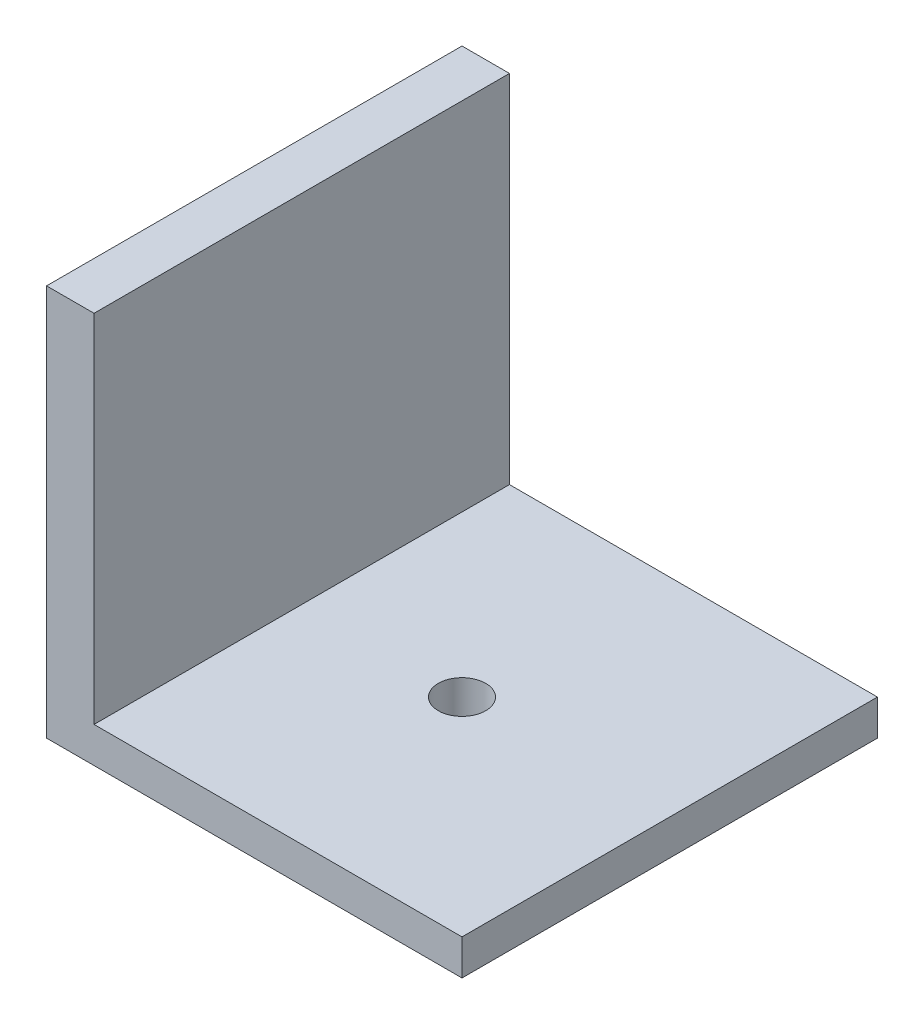
ISO-10303-21;
HEADER;
FILE_DESCRIPTION(('STEP AP214'),'2;1');
FILE_NAME('part.step','',(''),(''),'','','');
FILE_SCHEMA(('AUTOMOTIVE_DESIGN { 1 0 10303 214 1 1 1 1 }'));
ENDSEC;
DATA;
#1=APPLICATION_CONTEXT('core data for automotive mechanical design processes');
#2=APPLICATION_PROTOCOL_DEFINITION('international standard','automotive_design',2000,#1);
#3=PRODUCT_CONTEXT('',#1,'mechanical');
#4=PRODUCT('Part','Part','',(#3));
#5=PRODUCT_RELATED_PRODUCT_CATEGORY('part','',(#4));
#6=PRODUCT_DEFINITION_FORMATION('','',#4);
#7=PRODUCT_DEFINITION_CONTEXT('part definition',#1,'design');
#8=PRODUCT_DEFINITION('design','',#6,#7);
#9=PRODUCT_DEFINITION_SHAPE('','',#8);
#10=(LENGTH_UNIT() NAMED_UNIT(*) SI_UNIT(.MILLI.,.METRE.));
#11=(NAMED_UNIT(*) PLANE_ANGLE_UNIT() SI_UNIT($,.RADIAN.));
#12=(NAMED_UNIT(*) SI_UNIT($,.STERADIAN.) SOLID_ANGLE_UNIT());
#13=UNCERTAINTY_MEASURE_WITH_UNIT(LENGTH_MEASURE(1.E-05),#10,'distance_accuracy_value','');
#14=(GEOMETRIC_REPRESENTATION_CONTEXT(3) GLOBAL_UNCERTAINTY_ASSIGNED_CONTEXT((#13)) GLOBAL_UNIT_ASSIGNED_CONTEXT((#10,
#11,#12)) REPRESENTATION_CONTEXT('',''));
#15=CARTESIAN_POINT('',(0.,0.,0.));
#16=DIRECTION('',(0.,0.,1.));
#17=DIRECTION('',(1.,0.,0.));
#18=AXIS2_PLACEMENT_3D('',#15,#16,#17);
#19=CARTESIAN_POINT('',(0.,3.,0.));
#20=DIRECTION('',(0.,-1.,0.));
#21=DIRECTION('',(0.,0.,-1.));
#22=AXIS2_PLACEMENT_3D('',#19,#20,#21);
#23=PLANE('',#22);
#24=CARTESIAN_POINT('',(0.,3.,0.));
#25=DIRECTION('',(0.,1.,0.));
#26=DIRECTION('',(0.,0.,1.));
#27=AXIS2_PLACEMENT_3D('',#24,#25,#26);
#28=CIRCLE('',#27,2.);
#29=CARTESIAN_POINT('',(0.,3.,2.));
#30=VERTEX_POINT('',#29);
#31=EDGE_CURVE('E104',#30,#30,#28,.T.);
#32=ORIENTED_EDGE('',*,*,#31,.F.);
#33=EDGE_LOOP('',(#32));
#34=FACE_BOUND('',#33,.T.);
#35=DIRECTION('',(0.,0.,-1.));
#36=VECTOR('',#35,1.);
#37=CARTESIAN_POINT('',(-13.5,3.,-17.5));
#38=LINE('',#37,#36);
#39=CARTESIAN_POINT('',(-13.5,3.,17.5));
#40=VERTEX_POINT('',#39);
#41=CARTESIAN_POINT('',(-13.5,3.,-17.5));
#42=VERTEX_POINT('',#41);
#43=EDGE_CURVE('E56',#40,#42,#38,.T.);
#44=ORIENTED_EDGE('',*,*,#43,.F.);
#45=DIRECTION('',(1.,0.,0.));
#46=VECTOR('',#45,1.);
#47=CARTESIAN_POINT('',(-17.5,3.,17.5));
#48=LINE('',#47,#46);
#49=CARTESIAN_POINT('',(17.5,3.,17.5));
#50=VERTEX_POINT('',#49);
#51=EDGE_CURVE('E61',#40,#50,#48,.T.);
#52=ORIENTED_EDGE('',*,*,#51,.T.);
#53=DIRECTION('',(0.,0.,-1.));
#54=VECTOR('',#53,1.);
#55=CARTESIAN_POINT('',(17.5,3.,17.5));
#56=LINE('',#55,#54);
#57=CARTESIAN_POINT('',(17.5,3.,-17.5));
#58=VERTEX_POINT('',#57);
#59=EDGE_CURVE('E92',#50,#58,#56,.T.);
#60=ORIENTED_EDGE('',*,*,#59,.T.);
#61=DIRECTION('',(-1.,0.,0.));
#62=VECTOR('',#61,1.);
#63=CARTESIAN_POINT('',(-17.5,3.,-17.5));
#64=LINE('',#63,#62);
#65=EDGE_CURVE('E122',#58,#42,#64,.T.);
#66=ORIENTED_EDGE('',*,*,#65,.T.);
#67=EDGE_LOOP('',(#44,#52,#60,#66));
#68=FACE_BOUND('',#67,.T.);
#69=ADVANCED_FACE('F40',(#34,#68),#23,.F.);
#70=CARTESIAN_POINT('',(0.,0.,0.));
#71=DIRECTION('',(0.,-1.,0.));
#72=DIRECTION('',(0.,0.,-1.));
#73=AXIS2_PLACEMENT_3D('',#70,#71,#72);
#74=PLANE('',#73);
#75=DIRECTION('',(0.,0.,-1.));
#76=VECTOR('',#75,1.);
#77=CARTESIAN_POINT('',(17.5,0.,17.5));
#78=LINE('',#77,#76);
#79=CARTESIAN_POINT('',(17.5,0.,17.5));
#80=VERTEX_POINT('',#79);
#81=CARTESIAN_POINT('',(17.5,0.,-17.5));
#82=VERTEX_POINT('',#81);
#83=EDGE_CURVE('E98',#80,#82,#78,.T.);
#84=ORIENTED_EDGE('',*,*,#83,.F.);
#85=DIRECTION('',(1.,0.,0.));
#86=VECTOR('',#85,1.);
#87=CARTESIAN_POINT('',(-17.5,0.,17.5));
#88=LINE('',#87,#86);
#89=CARTESIAN_POINT('',(-17.5,0.,17.5));
#90=VERTEX_POINT('',#89);
#91=EDGE_CURVE('E81',#90,#80,#88,.T.);
#92=ORIENTED_EDGE('',*,*,#91,.F.);
#93=DIRECTION('',(0.,0.,1.));
#94=VECTOR('',#93,1.);
#95=CARTESIAN_POINT('',(-17.5,0.,17.5));
#96=LINE('',#95,#94);
#97=CARTESIAN_POINT('',(-17.5,0.,-17.5));
#98=VERTEX_POINT('',#97);
#99=EDGE_CURVE('E93',#98,#90,#96,.T.);
#100=ORIENTED_EDGE('',*,*,#99,.F.);
#101=DIRECTION('',(-1.,0.,0.));
#102=VECTOR('',#101,1.);
#103=CARTESIAN_POINT('',(-17.5,0.,-17.5));
#104=LINE('',#103,#102);
#105=EDGE_CURVE('E102',#82,#98,#104,.T.);
#106=ORIENTED_EDGE('',*,*,#105,.F.);
#107=EDGE_LOOP('',(#84,#92,#100,#106));
#108=FACE_BOUND('',#107,.T.);
#109=CARTESIAN_POINT('',(0.,0.,0.));
#110=DIRECTION('',(0.,1.,0.));
#111=DIRECTION('',(0.,0.,1.));
#112=AXIS2_PLACEMENT_3D('',#109,#110,#111);
#113=CIRCLE('',#112,2.);
#114=CARTESIAN_POINT('',(0.,0.,2.));
#115=VERTEX_POINT('',#114);
#116=EDGE_CURVE('E108',#115,#115,#113,.T.);
#117=ORIENTED_EDGE('',*,*,#116,.T.);
#118=EDGE_LOOP('',(#117));
#119=FACE_BOUND('',#118,.T.);
#120=ADVANCED_FACE('F100',(#108,#119),#74,.T.);
#121=CARTESIAN_POINT('',(17.5,3.,17.5));
#122=DIRECTION('',(-1.,0.,0.));
#123=DIRECTION('',(0.,0.,1.));
#124=AXIS2_PLACEMENT_3D('',#121,#122,#123);
#125=PLANE('',#124);
#126=ORIENTED_EDGE('',*,*,#83,.T.);
#127=DIRECTION('',(0.,-1.,0.));
#128=VECTOR('',#127,1.);
#129=CARTESIAN_POINT('',(17.5,3.,-17.5));
#130=LINE('',#129,#128);
#131=EDGE_CURVE('E44',#58,#82,#130,.T.);
#132=ORIENTED_EDGE('',*,*,#131,.F.);
#133=ORIENTED_EDGE('',*,*,#59,.F.);
#134=DIRECTION('',(0.,-1.,0.));
#135=VECTOR('',#134,1.);
#136=CARTESIAN_POINT('',(17.5,3.,17.5));
#137=LINE('',#136,#135);
#138=EDGE_CURVE('E84',#50,#80,#137,.T.);
#139=ORIENTED_EDGE('',*,*,#138,.T.);
#140=EDGE_LOOP('',(#126,#132,#133,#139));
#141=FACE_BOUND('',#140,.T.);
#142=ADVANCED_FACE('F42',(#141),#125,.F.);
#143=CARTESIAN_POINT('',(-17.5,3.,-17.5));
#144=DIRECTION('',(0.,0.,1.));
#145=DIRECTION('',(1.,0.,0.));
#146=AXIS2_PLACEMENT_3D('',#143,#144,#145);
#147=PLANE('',#146);
#148=ORIENTED_EDGE('',*,*,#105,.T.);
#149=DIRECTION('',(0.,-1.,0.));
#150=VECTOR('',#149,1.);
#151=CARTESIAN_POINT('',(-17.5,3.,-17.5));
#152=LINE('',#151,#150);
#153=CARTESIAN_POINT('',(-17.5,33.,-17.5));
#154=VERTEX_POINT('',#153);
#155=EDGE_CURVE('E114',#154,#98,#152,.T.);
#156=ORIENTED_EDGE('',*,*,#155,.F.);
#157=DIRECTION('',(-1.,0.,0.));
#158=VECTOR('',#157,1.);
#159=CARTESIAN_POINT('',(-17.5,33.,-17.5));
#160=LINE('',#159,#158);
#161=CARTESIAN_POINT('',(-13.5,33.,-17.5));
#162=VERTEX_POINT('',#161);
#163=EDGE_CURVE('E135',#162,#154,#160,.T.);
#164=ORIENTED_EDGE('',*,*,#163,.F.);
#165=DIRECTION('',(0.,-1.,0.));
#166=VECTOR('',#165,1.);
#167=CARTESIAN_POINT('',(-13.5,33.,-17.5));
#168=LINE('',#167,#166);
#169=EDGE_CURVE('E126',#162,#42,#168,.T.);
#170=ORIENTED_EDGE('',*,*,#169,.T.);
#171=ORIENTED_EDGE('',*,*,#65,.F.);
#172=ORIENTED_EDGE('',*,*,#131,.T.);
#173=EDGE_LOOP('',(#148,#156,#164,#170,#171,#172));
#174=FACE_BOUND('',#173,.T.);
#175=ADVANCED_FACE('F120',(#174),#147,.F.);
#176=CARTESIAN_POINT('',(-17.5,3.,17.5));
#177=DIRECTION('',(1.,0.,0.));
#178=DIRECTION('',(0.,0.,-1.));
#179=AXIS2_PLACEMENT_3D('',#176,#177,#178);
#180=PLANE('',#179);
#181=CARTESIAN_POINT('',(-17.5,16.5,0.));
#182=DIRECTION('',(-1.,0.,0.));
#183=DIRECTION('',(0.,0.,1.));
#184=AXIS2_PLACEMENT_3D('',#181,#182,#183);
#185=CIRCLE('',#184,4.);
#186=CARTESIAN_POINT('',(-17.5,16.5,4.));
#187=VERTEX_POINT('',#186);
#188=EDGE_CURVE('E11',#187,#187,#185,.T.);
#189=ORIENTED_EDGE('',*,*,#188,.F.);
#190=EDGE_LOOP('',(#189));
#191=FACE_BOUND('',#190,.T.);
#192=ORIENTED_EDGE('',*,*,#99,.T.);
#193=DIRECTION('',(0.,-1.,0.));
#194=VECTOR('',#193,1.);
#195=CARTESIAN_POINT('',(-17.5,3.,17.5));
#196=LINE('',#195,#194);
#197=CARTESIAN_POINT('',(-17.5,33.,17.5));
#198=VERTEX_POINT('',#197);
#199=EDGE_CURVE('E88',#198,#90,#196,.T.);
#200=ORIENTED_EDGE('',*,*,#199,.F.);
#201=DIRECTION('',(0.,0.,1.));
#202=VECTOR('',#201,1.);
#203=CARTESIAN_POINT('',(-17.5,33.,-17.5));
#204=LINE('',#203,#202);
#205=EDGE_CURVE('E137',#154,#198,#204,.T.);
#206=ORIENTED_EDGE('',*,*,#205,.F.);
#207=ORIENTED_EDGE('',*,*,#155,.T.);
#208=EDGE_LOOP('',(#192,#200,#206,#207));
#209=FACE_BOUND('',#208,.T.);
#210=ADVANCED_FACE('F161',(#191,#209),#180,.F.);
#211=CARTESIAN_POINT('',(-17.5,3.,17.5));
#212=DIRECTION('',(0.,0.,-1.));
#213=DIRECTION('',(-1.,0.,0.));
#214=AXIS2_PLACEMENT_3D('',#211,#212,#213);
#215=PLANE('',#214);
#216=ORIENTED_EDGE('',*,*,#91,.T.);
#217=ORIENTED_EDGE('',*,*,#138,.F.);
#218=ORIENTED_EDGE('',*,*,#51,.F.);
#219=DIRECTION('',(0.,-1.,0.));
#220=VECTOR('',#219,1.);
#221=CARTESIAN_POINT('',(-13.5,33.,17.5));
#222=LINE('',#221,#220);
#223=CARTESIAN_POINT('',(-13.5,33.,17.5));
#224=VERTEX_POINT('',#223);
#225=EDGE_CURVE('E130',#224,#40,#222,.T.);
#226=ORIENTED_EDGE('',*,*,#225,.F.);
#227=DIRECTION('',(1.,0.,0.));
#228=VECTOR('',#227,1.);
#229=CARTESIAN_POINT('',(-17.5,33.,17.5));
#230=LINE('',#229,#228);
#231=EDGE_CURVE('E144',#198,#224,#230,.T.);
#232=ORIENTED_EDGE('',*,*,#231,.F.);
#233=ORIENTED_EDGE('',*,*,#199,.T.);
#234=EDGE_LOOP('',(#216,#217,#218,#226,#232,#233));
#235=FACE_BOUND('',#234,.T.);
#236=ADVANCED_FACE('F83',(#235),#215,.F.);
#237=CARTESIAN_POINT('',(0.,3.,0.));
#238=DIRECTION('',(0.,-1.,0.));
#239=DIRECTION('',(0.,0.,-1.));
#240=AXIS2_PLACEMENT_3D('',#237,#238,#239);
#241=CYLINDRICAL_SURFACE('',#240,2.);
#242=ORIENTED_EDGE('',*,*,#31,.T.);
#243=EDGE_LOOP('',(#242));
#244=FACE_BOUND('',#243,.T.);
#245=ORIENTED_EDGE('',*,*,#116,.F.);
#246=EDGE_LOOP('',(#245));
#247=FACE_BOUND('',#246,.T.);
#248=ADVANCED_FACE('F177',(#244,#247),#241,.F.);
#249=CARTESIAN_POINT('',(-13.5,33.,-17.5));
#250=DIRECTION('',(-1.,0.,0.));
#251=DIRECTION('',(0.,0.,1.));
#252=AXIS2_PLACEMENT_3D('',#249,#250,#251);
#253=PLANE('',#252);
#254=ORIENTED_EDGE('',*,*,#43,.T.);
#255=ORIENTED_EDGE('',*,*,#169,.F.);
#256=DIRECTION('',(0.,0.,-1.));
#257=VECTOR('',#256,1.);
#258=CARTESIAN_POINT('',(-13.5,33.,-17.5));
#259=LINE('',#258,#257);
#260=EDGE_CURVE('E141',#224,#162,#259,.T.);
#261=ORIENTED_EDGE('',*,*,#260,.F.);
#262=ORIENTED_EDGE('',*,*,#225,.T.);
#263=EDGE_LOOP('',(#254,#255,#261,#262));
#264=FACE_BOUND('',#263,.T.);
#265=ADVANCED_FACE('F175',(#264),#253,.F.);
#266=CARTESIAN_POINT('',(0.,33.,0.));
#267=DIRECTION('',(0.,1.,0.));
#268=DIRECTION('',(0.,0.,1.));
#269=AXIS2_PLACEMENT_3D('',#266,#267,#268);
#270=PLANE('',#269);
#271=ORIENTED_EDGE('',*,*,#205,.T.);
#272=ORIENTED_EDGE('',*,*,#231,.T.);
#273=ORIENTED_EDGE('',*,*,#260,.T.);
#274=ORIENTED_EDGE('',*,*,#163,.T.);
#275=EDGE_LOOP('',(#271,#272,#273,#274));
#276=FACE_BOUND('',#275,.T.);
#277=ADVANCED_FACE('F157',(#276),#270,.T.);
#278=CARTESIAN_POINT('',(-25.5,16.5,0.));
#279=DIRECTION('',(1.,0.,0.));
#280=DIRECTION('',(0.,0.,-1.));
#281=AXIS2_PLACEMENT_3D('',#278,#279,#280);
#282=CYLINDRICAL_SURFACE('',#281,4.);
#283=CARTESIAN_POINT('',(-25.5,16.5,0.));
#284=DIRECTION('',(-1.,0.,0.));
#285=DIRECTION('',(0.,0.,1.));
#286=AXIS2_PLACEMENT_3D('',#283,#284,#285);
#287=CIRCLE('',#286,4.);
#288=CARTESIAN_POINT('',(-25.5,16.5,4.));
#289=VERTEX_POINT('',#288);
#290=EDGE_CURVE('E138',#289,#289,#287,.T.);
#291=ORIENTED_EDGE('',*,*,#290,.F.);
#292=EDGE_LOOP('',(#291));
#293=FACE_BOUND('',#292,.T.);
#294=ORIENTED_EDGE('',*,*,#188,.T.);
#295=EDGE_LOOP('',(#294));
#296=FACE_BOUND('',#295,.T.);
#297=ADVANCED_FACE('F154',(#293,#296),#282,.T.);
#298=CARTESIAN_POINT('',(-25.5,16.5,0.));
#299=DIRECTION('',(-1.,0.,0.));
#300=DIRECTION('',(0.,0.,1.));
#301=AXIS2_PLACEMENT_3D('',#298,#299,#300);
#302=PLANE('',#301);
#303=ORIENTED_EDGE('',*,*,#290,.T.);
#304=EDGE_LOOP('',(#303));
#305=FACE_BOUND('',#304,.T.);
#306=ADVANCED_FACE('F152',(#305),#302,.T.);
#307=CLOSED_SHELL('',(#69,#120,#142,#175,#210,#236,#248,#265,#277,#297,#306));
#308=MANIFOLD_SOLID_BREP('B2',#307);
#309=ADVANCED_BREP_SHAPE_REPRESENTATION('',(#18,#308),#14);
#310=SHAPE_DEFINITION_REPRESENTATION(#9,#309);
ENDSEC;
END-ISO-10303-21;
